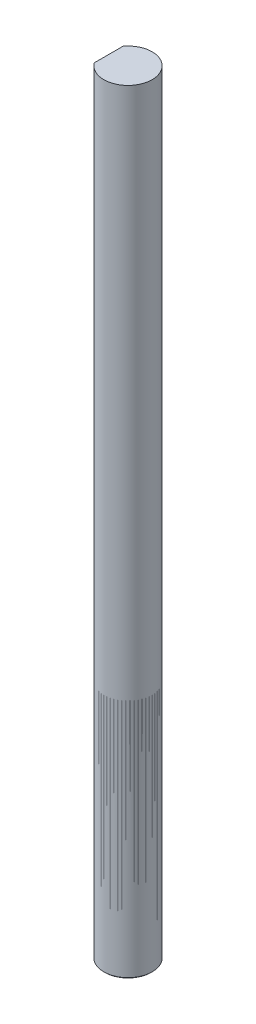
ISO-10303-21;
HEADER;
FILE_DESCRIPTION(('STEP AP214'),'2;1');
FILE_NAME('part.step','',(''),(''),'','','');
FILE_SCHEMA(('AUTOMOTIVE_DESIGN { 1 0 10303 214 1 1 1 1 }'));
ENDSEC;
DATA;
#1=APPLICATION_CONTEXT('core data for automotive mechanical design processes');
#2=APPLICATION_PROTOCOL_DEFINITION('international standard','automotive_design',2000,#1);
#3=PRODUCT_CONTEXT('',#1,'mechanical');
#4=PRODUCT('Part','Part','',(#3));
#5=PRODUCT_RELATED_PRODUCT_CATEGORY('part','',(#4));
#6=PRODUCT_DEFINITION_FORMATION('','',#4);
#7=PRODUCT_DEFINITION_CONTEXT('part definition',#1,'design');
#8=PRODUCT_DEFINITION('design','',#6,#7);
#9=PRODUCT_DEFINITION_SHAPE('','',#8);
#10=(LENGTH_UNIT() NAMED_UNIT(*) SI_UNIT(.MILLI.,.METRE.));
#11=(NAMED_UNIT(*) PLANE_ANGLE_UNIT() SI_UNIT($,.RADIAN.));
#12=(NAMED_UNIT(*) SI_UNIT($,.STERADIAN.) SOLID_ANGLE_UNIT());
#13=UNCERTAINTY_MEASURE_WITH_UNIT(LENGTH_MEASURE(1.E-05),#10,'distance_accuracy_value','');
#14=(GEOMETRIC_REPRESENTATION_CONTEXT(3) GLOBAL_UNCERTAINTY_ASSIGNED_CONTEXT((#13)) GLOBAL_UNIT_ASSIGNED_CONTEXT((#10,
#11,#12)) REPRESENTATION_CONTEXT('',''));
#15=CARTESIAN_POINT('',(0.,0.,0.));
#16=DIRECTION('',(0.,0.,1.));
#17=DIRECTION('',(1.,0.,0.));
#18=AXIS2_PLACEMENT_3D('',#15,#16,#17);
#19=CARTESIAN_POINT('',(0.,0.127000000000009,0.));
#20=DIRECTION('',(0.,1.,0.));
#21=DIRECTION('',(0.,0.,1.));
#22=AXIS2_PLACEMENT_3D('',#19,#20,#21);
#23=CONICAL_SURFACE('',#22,3.17119,0.785398163397443);
#24=DIRECTION('',(0.,0.707106781186551,-0.707106781186544));
#25=VECTOR('',#24,1.);
#26=CARTESIAN_POINT('',(0.,0.127000000000009,-3.17119));
#27=LINE('',#26,#25);
#28=CARTESIAN_POINT('',(0.,0.,-3.04419));
#29=VERTEX_POINT('',#28);
#30=CARTESIAN_POINT('',(0.,0.127000000000009,-3.17119));
#31=VERTEX_POINT('',#30);
#32=EDGE_CURVE('P0_E52',#29,#31,#27,.T.);
#33=ORIENTED_EDGE('',*,*,#32,.F.);
#34=CARTESIAN_POINT('',(0.,0.,0.));
#35=DIRECTION('',(0.,-1.,0.));
#36=DIRECTION('',(0.,0.,1.));
#37=AXIS2_PLACEMENT_3D('',#34,#35,#36);
#38=CIRCLE('',#37,3.04419);
#39=CARTESIAN_POINT('',(-2.54381,0.,-1.67216130800828));
#40=VERTEX_POINT('',#39);
#41=EDGE_CURVE('P0_E14',#40,#29,#38,.T.);
#42=ORIENTED_EDGE('',*,*,#41,.F.);
#43=CARTESIAN_POINT('',(-2.54381,0.127000000000009,-1.89353550270387));
#44=CARTESIAN_POINT('',(-2.54381,0.0833862535559544,-1.8204935785422));
#45=CARTESIAN_POINT('',(-2.54381,0.0409575857320586,-1.7467250910073));
#46=CARTESIAN_POINT('',(-2.54381,0.,-1.67216130800828));
#47=(BOUNDED_CURVE() B_SPLINE_CURVE(3,(#43,#44,#45,#46),.UNSPECIFIED.,.F.,
.F.) B_SPLINE_CURVE_WITH_KNOTS((4,4),(0.,0.000255216641458047),
.UNSPECIFIED.) CURVE() GEOMETRIC_REPRESENTATION_ITEM() RATIONAL_B_SPLINE_CURVE((1.,1.,1.,1.)) REPRESENTATION_ITEM(''));
#48=CARTESIAN_POINT('',(-2.54381,0.127000000000009,-1.89353550270387));
#49=VERTEX_POINT('',#48);
#50=EDGE_CURVE('P0_E104',#49,#40,#47,.T.);
#51=ORIENTED_EDGE('',*,*,#50,.F.);
#52=CARTESIAN_POINT('',(0.,0.127000000000009,0.));
#53=DIRECTION('',(0.,1.,0.));
#54=DIRECTION('',(0.,0.,1.));
#55=AXIS2_PLACEMENT_3D('',#52,#53,#54);
#56=CIRCLE('',#55,3.17119);
#57=EDGE_CURVE('P0_E99',#31,#49,#56,.T.);
#58=ORIENTED_EDGE('',*,*,#57,.F.);
#59=EDGE_LOOP('',(#33,#42,#51,#58));
#60=FACE_BOUND('',#59,.T.);
#61=ADVANCED_FACE('P0_F48',(#60),#23,.T.);
#62=CARTESIAN_POINT('',(0.,0.,0.));
#63=DIRECTION('',(0.,1.,0.));
#64=DIRECTION('',(1.,0.,0.));
#65=AXIS2_PLACEMENT_3D('',#62,#63,#64);
#66=PLANE('',#65);
#67=DIRECTION('',(0.,0.,1.));
#68=VECTOR('',#67,1.);
#69=CARTESIAN_POINT('',(-2.54381,0.,-1.89353550270387));
#70=LINE('',#69,#68);
#71=CARTESIAN_POINT('',(-2.54381,0.,1.67216130800828));
#72=VERTEX_POINT('',#71);
#73=EDGE_CURVE('P0_E59',#40,#72,#70,.T.);
#74=ORIENTED_EDGE('',*,*,#73,.F.);
#75=ORIENTED_EDGE('',*,*,#41,.T.);
#76=CARTESIAN_POINT('',(0.,0.,0.));
#77=DIRECTION('',(0.,-1.,0.));
#78=DIRECTION('',(0.,0.,1.));
#79=AXIS2_PLACEMENT_3D('',#76,#77,#78);
#80=CIRCLE('',#79,3.04419);
#81=CARTESIAN_POINT('',(0.,0.,3.04419));
#82=VERTEX_POINT('',#81);
#83=EDGE_CURVE('P0_E125',#29,#82,#80,.T.);
#84=ORIENTED_EDGE('',*,*,#83,.T.);
#85=CARTESIAN_POINT('',(0.,0.,0.));
#86=DIRECTION('',(0.,-1.,0.));
#87=DIRECTION('',(0.,0.,1.));
#88=AXIS2_PLACEMENT_3D('',#85,#86,#87);
#89=CIRCLE('',#88,3.04419);
#90=EDGE_CURVE('P0_E142',#82,#72,#89,.T.);
#91=ORIENTED_EDGE('',*,*,#90,.T.);
#92=EDGE_LOOP('',(#74,#75,#84,#91));
#93=FACE_BOUND('',#92,.T.);
#94=ADVANCED_FACE('P0_F50',(#93),#66,.F.);
#95=CARTESIAN_POINT('',(-2.54381,31.75,-1.89353550270387));
#96=DIRECTION('',(1.,0.,0.));
#97=DIRECTION('',(0.,1.,0.));
#98=AXIS2_PLACEMENT_3D('',#95,#96,#97);
#99=PLANE('',#98);
#100=DIRECTION('',(0.,-1.,0.));
#101=VECTOR('',#100,1.);
#102=CARTESIAN_POINT('',(-2.54381,31.75,1.89353550270387));
#103=LINE('',#102,#101);
#104=CARTESIAN_POINT('',(-2.54381,101.6,1.89353550270387));
#105=VERTEX_POINT('',#104);
#106=CARTESIAN_POINT('',(-2.54381,0.127000000000009,1.89353550270387));
#107=VERTEX_POINT('',#106);
#108=EDGE_CURVE('P0_E158',#105,#107,#103,.T.);
#109=ORIENTED_EDGE('',*,*,#108,.F.);
#110=DIRECTION('',(0.,0.,1.));
#111=VECTOR('',#110,1.);
#112=CARTESIAN_POINT('',(-2.54381,101.6,1.6721613080083));
#113=LINE('',#112,#111);
#114=CARTESIAN_POINT('',(-2.54381,101.6,-1.89353550270387));
#115=VERTEX_POINT('',#114);
#116=EDGE_CURVE('P0_E131',#115,#105,#113,.T.);
#117=ORIENTED_EDGE('',*,*,#116,.F.);
#118=DIRECTION('',(0.,-1.,0.));
#119=VECTOR('',#118,1.);
#120=CARTESIAN_POINT('',(-2.54381,31.75,-1.89353550270387));
#121=LINE('',#120,#119);
#122=EDGE_CURVE('P0_E108',#115,#49,#121,.T.);
#123=ORIENTED_EDGE('',*,*,#122,.T.);
#124=ORIENTED_EDGE('',*,*,#50,.T.);
#125=ORIENTED_EDGE('',*,*,#73,.T.);
#126=CARTESIAN_POINT('',(-2.54381,0.,1.67216130800828));
#127=CARTESIAN_POINT('',(-2.54381,0.0409575857320651,1.7467250910073));
#128=CARTESIAN_POINT('',(-2.54381,0.0833862535559509,1.8204935785422));
#129=CARTESIAN_POINT('',(-2.54381,0.127000000000009,1.89353550270387));
#130=(BOUNDED_CURVE() B_SPLINE_CURVE(3,(#126,#127,#128,#129),.UNSPECIFIED.,.F.,
.F.) B_SPLINE_CURVE_WITH_KNOTS((4,4),(0.,0.000255216641458047),
.UNSPECIFIED.) CURVE() GEOMETRIC_REPRESENTATION_ITEM() RATIONAL_B_SPLINE_CURVE((1.,1.,1.,1.)) REPRESENTATION_ITEM(''));
#131=EDGE_CURVE('P0_E146',#72,#107,#130,.T.);
#132=ORIENTED_EDGE('',*,*,#131,.T.);
#133=EDGE_LOOP('',(#109,#117,#123,#124,#125,#132));
#134=FACE_BOUND('',#133,.T.);
#135=ADVANCED_FACE('P0_F169',(#134),#99,.F.);
#136=CARTESIAN_POINT('',(0.,31.75,0.));
#137=DIRECTION('',(0.,-1.,0.));
#138=DIRECTION('',(0.,0.,-1.));
#139=AXIS2_PLACEMENT_3D('',#136,#137,#138);
#140=CYLINDRICAL_SURFACE('',#139,3.17119);
#141=DIRECTION('',(0.,-1.,0.));
#142=VECTOR('',#141,1.);
#143=CARTESIAN_POINT('',(0.,31.75,-3.17119));
#144=LINE('',#143,#142);
#145=CARTESIAN_POINT('',(0.,31.75,-3.17119));
#146=VERTEX_POINT('',#145);
#147=EDGE_CURVE('P0_E109',#146,#31,#144,.T.);
#148=ORIENTED_EDGE('',*,*,#147,.F.);
#149=ORIENTED_EDGE('',*,*,#147,.T.);
#150=ORIENTED_EDGE('',*,*,#57,.T.);
#151=ORIENTED_EDGE('',*,*,#122,.F.);
#152=CARTESIAN_POINT('',(0.,101.6,0.));
#153=DIRECTION('',(0.,1.,0.));
#154=DIRECTION('',(0.,0.,1.));
#155=AXIS2_PLACEMENT_3D('',#152,#153,#154);
#156=CIRCLE('',#155,3.17119);
#157=EDGE_CURVE('P0_E138',#105,#115,#156,.T.);
#158=ORIENTED_EDGE('',*,*,#157,.F.);
#159=ORIENTED_EDGE('',*,*,#108,.T.);
#160=CARTESIAN_POINT('',(0.,0.127000000000009,0.));
#161=DIRECTION('',(0.,1.,0.));
#162=DIRECTION('',(0.,0.,1.));
#163=AXIS2_PLACEMENT_3D('',#160,#161,#162);
#164=CIRCLE('',#163,3.17119);
#165=CARTESIAN_POINT('',(0.,0.127000000000009,3.17119));
#166=VERTEX_POINT('',#165);
#167=EDGE_CURVE('P0_E143',#107,#166,#164,.T.);
#168=ORIENTED_EDGE('',*,*,#167,.T.);
#169=DIRECTION('',(0.,-1.,0.));
#170=VECTOR('',#169,1.);
#171=CARTESIAN_POINT('',(0.,31.75,3.17119));
#172=LINE('',#171,#170);
#173=CARTESIAN_POINT('',(0.,31.75,3.17119));
#174=VERTEX_POINT('',#173);
#175=EDGE_CURVE('P0_E93',#174,#166,#172,.T.);
#176=ORIENTED_EDGE('',*,*,#175,.F.);
#177=ORIENTED_EDGE('',*,*,#175,.T.);
#178=CARTESIAN_POINT('',(0.,0.127000000000009,0.));
#179=DIRECTION('',(0.,1.,0.));
#180=DIRECTION('',(0.,0.,1.));
#181=AXIS2_PLACEMENT_3D('',#178,#179,#180);
#182=CIRCLE('',#181,3.17119);
#183=EDGE_CURVE('P0_E117',#166,#31,#182,.T.);
#184=ORIENTED_EDGE('',*,*,#183,.T.);
#185=EDGE_LOOP('',(#148,#149,#150,#151,#158,#159,#168,#176,#177,#184));
#186=FACE_BOUND('',#185,.T.);
#187=ADVANCED_FACE('P0_F112',(#186),#140,.T.);
#188=CARTESIAN_POINT('',(0.,0.127000000000009,0.));
#189=DIRECTION('',(0.,1.,0.));
#190=DIRECTION('',(0.,0.,1.));
#191=AXIS2_PLACEMENT_3D('',#188,#189,#190);
#192=CONICAL_SURFACE('',#191,3.17119,0.785398163397443);
#193=ORIENTED_EDGE('',*,*,#90,.F.);
#194=DIRECTION('',(0.,0.707106781186551,0.707106781186544));
#195=VECTOR('',#194,1.);
#196=CARTESIAN_POINT('',(0.,0.127000000000009,3.17119));
#197=LINE('',#196,#195);
#198=EDGE_CURVE('P0_E121',#82,#166,#197,.T.);
#199=ORIENTED_EDGE('',*,*,#198,.T.);
#200=ORIENTED_EDGE('',*,*,#167,.F.);
#201=ORIENTED_EDGE('',*,*,#131,.F.);
#202=EDGE_LOOP('',(#193,#199,#200,#201));
#203=FACE_BOUND('',#202,.T.);
#204=ADVANCED_FACE('P0_F199',(#203),#192,.T.);
#205=CARTESIAN_POINT('',(0.,0.127000000000009,0.));
#206=DIRECTION('',(0.,1.,0.));
#207=DIRECTION('',(0.,0.,1.));
#208=AXIS2_PLACEMENT_3D('',#205,#206,#207);
#209=CONICAL_SURFACE('',#208,3.17119,0.785398163397443);
#210=ORIENTED_EDGE('',*,*,#83,.F.);
#211=ORIENTED_EDGE('',*,*,#32,.T.);
#212=ORIENTED_EDGE('',*,*,#183,.F.);
#213=ORIENTED_EDGE('',*,*,#198,.F.);
#214=EDGE_LOOP('',(#210,#211,#212,#213));
#215=FACE_BOUND('',#214,.T.);
#216=ADVANCED_FACE('P0_F123',(#215),#209,.T.);
#217=CARTESIAN_POINT('',(0.,101.6,0.));
#218=DIRECTION('',(0.,1.,0.));
#219=DIRECTION('',(1.,0.,0.));
#220=AXIS2_PLACEMENT_3D('',#217,#218,#219);
#221=PLANE('',#220);
#222=ORIENTED_EDGE('',*,*,#157,.T.);
#223=ORIENTED_EDGE('',*,*,#116,.T.);
#224=EDGE_LOOP('',(#222,#223));
#225=FACE_BOUND('',#224,.T.);
#226=ADVANCED_FACE('P0_F193',(#225),#221,.T.);
#227=CLOSED_SHELL('',(#61,#94,#135,#187,#204,#216,#226));
#228=MANIFOLD_SOLID_BREP('P0_B2',#227);
#229=CARTESIAN_POINT('',(0.,31.75,0.));
#230=DIRECTION('',(0.,-1.,0.));
#231=DIRECTION('',(0.,0.,-1.));
#232=AXIS2_PLACEMENT_3D('',#229,#230,#231);
#233=CONICAL_SURFACE('',#232,3.04419,0.785398163397443);
#234=DIRECTION('',(0.,-0.707106781186551,0.707106781186544));
#235=VECTOR('',#234,1.);
#236=CARTESIAN_POINT('',(0.,31.75,3.04419));
#237=LINE('',#236,#235);
#238=CARTESIAN_POINT('',(0.,31.75,3.04419));
#239=VERTEX_POINT('',#238);
#240=CARTESIAN_POINT('',(0.,31.623,3.17119));
#241=VERTEX_POINT('',#240);
#242=EDGE_CURVE('P1_E148',#239,#241,#237,.T.);
#243=ORIENTED_EDGE('',*,*,#242,.F.);
#244=CARTESIAN_POINT('',(0.,31.75,0.));
#245=DIRECTION('',(0.,1.,0.));
#246=DIRECTION('',(0.,0.,1.));
#247=AXIS2_PLACEMENT_3D('',#244,#245,#246);
#248=CIRCLE('',#247,3.04419);
#249=CARTESIAN_POINT('',(-2.54381,31.75,1.6721613080083));
#250=VERTEX_POINT('',#249);
#251=EDGE_CURVE('P1_E29',#250,#239,#248,.T.);
#252=ORIENTED_EDGE('',*,*,#251,.F.);
#253=CARTESIAN_POINT('',(-2.54381,31.623,1.89353550270387));
#254=CARTESIAN_POINT('',(-2.54381,31.666613746444,1.82049357854221));
#255=CARTESIAN_POINT('',(-2.54381,31.7090424142679,1.74672509100733));
#256=CARTESIAN_POINT('',(-2.54381,31.75,1.6721613080083));
#257=(BOUNDED_CURVE() B_SPLINE_CURVE(3,(#253,#254,#255,#256),.UNSPECIFIED.,.F.,
.F.) B_SPLINE_CURVE_WITH_KNOTS((4,4),(0.,0.000255216641458017),
.UNSPECIFIED.) CURVE() GEOMETRIC_REPRESENTATION_ITEM() RATIONAL_B_SPLINE_CURVE((1.,1.,1.,1.)) REPRESENTATION_ITEM(''));
#258=CARTESIAN_POINT('',(-2.54381,31.623,1.89353550270387));
#259=VERTEX_POINT('',#258);
#260=EDGE_CURVE('P1_E204',#259,#250,#257,.T.);
#261=ORIENTED_EDGE('',*,*,#260,.F.);
#262=CARTESIAN_POINT('',(0.,31.623,0.));
#263=DIRECTION('',(0.,-1.,0.));
#264=DIRECTION('',(0.,0.,1.));
#265=AXIS2_PLACEMENT_3D('',#262,#263,#264);
#266=CIRCLE('',#265,3.17119);
#267=EDGE_CURVE('P1_E159',#241,#259,#266,.T.);
#268=ORIENTED_EDGE('',*,*,#267,.F.);
#269=EDGE_LOOP('',(#243,#252,#261,#268));
#270=FACE_BOUND('',#269,.T.);
#271=ADVANCED_FACE('P1_F18',(#270),#233,.T.);
#272=CARTESIAN_POINT('',(0.,0.127000000000009,0.));
#273=DIRECTION('',(0.,1.,0.));
#274=DIRECTION('',(0.,0.,1.));
#275=AXIS2_PLACEMENT_3D('',#272,#273,#274);
#276=CONICAL_SURFACE('',#275,3.17119,0.785398163397443);
#277=DIRECTION('',(0.,0.707106781186551,-0.707106781186544));
#278=VECTOR('',#277,1.);
#279=CARTESIAN_POINT('',(0.,0.127000000000009,-3.17119));
#280=LINE('',#279,#278);
#281=CARTESIAN_POINT('',(0.,0.,-3.04419));
#282=VERTEX_POINT('',#281);
#283=CARTESIAN_POINT('',(0.,0.127000000000009,-3.17119));
#284=VERTEX_POINT('',#283);
#285=EDGE_CURVE('P1_E22',#282,#284,#280,.T.);
#286=ORIENTED_EDGE('',*,*,#285,.F.);
#287=CARTESIAN_POINT('',(0.,0.,0.));
#288=DIRECTION('',(0.,-1.,0.));
#289=DIRECTION('',(0.,0.,1.));
#290=AXIS2_PLACEMENT_3D('',#287,#288,#289);
#291=CIRCLE('',#290,3.04419);
#292=CARTESIAN_POINT('',(-2.54381,0.,-1.67216130800828));
#293=VERTEX_POINT('',#292);
#294=EDGE_CURVE('P1_E12',#293,#282,#291,.T.);
#295=ORIENTED_EDGE('',*,*,#294,.F.);
#296=CARTESIAN_POINT('',(-2.54381,0.127000000000009,-1.89353550270387));
#297=CARTESIAN_POINT('',(-2.54381,0.0833862535559544,-1.8204935785422));
#298=CARTESIAN_POINT('',(-2.54381,0.0409575857320586,-1.7467250910073));
#299=CARTESIAN_POINT('',(-2.54381,0.,-1.67216130800828));
#300=(BOUNDED_CURVE() B_SPLINE_CURVE(3,(#296,#297,#298,#299),.UNSPECIFIED.,.F.,
.F.) B_SPLINE_CURVE_WITH_KNOTS((4,4),(0.,0.000255216641458047),
.UNSPECIFIED.) CURVE() GEOMETRIC_REPRESENTATION_ITEM() RATIONAL_B_SPLINE_CURVE((1.,1.,1.,1.)) REPRESENTATION_ITEM(''));
#301=CARTESIAN_POINT('',(-2.54381,0.127000000000009,-1.89353550270387));
#302=VERTEX_POINT('',#301);
#303=EDGE_CURVE('P1_E158',#302,#293,#300,.T.);
#304=ORIENTED_EDGE('',*,*,#303,.F.);
#305=CARTESIAN_POINT('',(0.,0.127000000000009,0.));
#306=DIRECTION('',(0.,1.,0.));
#307=DIRECTION('',(0.,0.,1.));
#308=AXIS2_PLACEMENT_3D('',#305,#306,#307);
#309=CIRCLE('',#308,3.17119);
#310=EDGE_CURVE('P1_E76',#284,#302,#309,.T.);
#311=ORIENTED_EDGE('',*,*,#310,.F.);
#312=EDGE_LOOP('',(#286,#295,#304,#311));
#313=FACE_BOUND('',#312,.T.);
#314=ADVANCED_FACE('P1_F272',(#313),#276,.T.);
#315=CARTESIAN_POINT('',(0.,0.,0.));
#316=DIRECTION('',(0.,1.,0.));
#317=DIRECTION('',(1.,0.,0.));
#318=AXIS2_PLACEMENT_3D('',#315,#316,#317);
#319=PLANE('',#318);
#320=DIRECTION('',(0.,0.,1.));
#321=VECTOR('',#320,1.);
#322=CARTESIAN_POINT('',(-2.54381,0.,-1.89353550270387));
#323=LINE('',#322,#321);
#324=CARTESIAN_POINT('',(-2.54381,0.,1.67216130800828));
#325=VERTEX_POINT('',#324);
#326=EDGE_CURVE('P1_E201',#293,#325,#323,.T.);
#327=ORIENTED_EDGE('',*,*,#326,.F.);
#328=ORIENTED_EDGE('',*,*,#294,.T.);
#329=CARTESIAN_POINT('',(0.,0.,0.));
#330=DIRECTION('',(0.,-1.,0.));
#331=DIRECTION('',(0.,0.,1.));
#332=AXIS2_PLACEMENT_3D('',#329,#330,#331);
#333=CIRCLE('',#332,3.04419);
#334=CARTESIAN_POINT('',(0.,0.,3.04419));
#335=VERTEX_POINT('',#334);
#336=EDGE_CURVE('P1_E167',#282,#335,#333,.T.);
#337=ORIENTED_EDGE('',*,*,#336,.T.);
#338=CARTESIAN_POINT('',(0.,0.,0.));
#339=DIRECTION('',(0.,-1.,0.));
#340=DIRECTION('',(0.,0.,1.));
#341=AXIS2_PLACEMENT_3D('',#338,#339,#340);
#342=CIRCLE('',#341,3.04419);
#343=EDGE_CURVE('P1_E87',#335,#325,#342,.T.);
#344=ORIENTED_EDGE('',*,*,#343,.T.);
#345=EDGE_LOOP('',(#327,#328,#337,#344));
#346=FACE_BOUND('',#345,.T.);
#347=ADVANCED_FACE('P1_F277',(#346),#319,.F.);
#348=CARTESIAN_POINT('',(0.,31.75,0.));
#349=DIRECTION('',(0.,1.,0.));
#350=DIRECTION('',(1.,0.,0.));
#351=AXIS2_PLACEMENT_3D('',#348,#349,#350);
#352=PLANE('',#351);
#353=DIRECTION('',(0.,0.,1.));
#354=VECTOR('',#353,1.);
#355=CARTESIAN_POINT('',(-2.54381,31.75,-1.89353550270387));
#356=LINE('',#355,#354);
#357=CARTESIAN_POINT('',(-2.54381,31.75,-1.6721613080083));
#358=VERTEX_POINT('',#357);
#359=EDGE_CURVE('P1_E224',#358,#250,#356,.T.);
#360=ORIENTED_EDGE('',*,*,#359,.T.);
#361=ORIENTED_EDGE('',*,*,#251,.T.);
#362=CARTESIAN_POINT('',(0.,31.75,0.));
#363=DIRECTION('',(0.,1.,0.));
#364=DIRECTION('',(0.,0.,1.));
#365=AXIS2_PLACEMENT_3D('',#362,#363,#364);
#366=CIRCLE('',#365,3.04419);
#367=CARTESIAN_POINT('',(0.,31.75,-3.04419));
#368=VERTEX_POINT('',#367);
#369=EDGE_CURVE('P1_E142',#239,#368,#366,.T.);
#370=ORIENTED_EDGE('',*,*,#369,.T.);
#371=CARTESIAN_POINT('',(0.,31.75,0.));
#372=DIRECTION('',(0.,1.,0.));
#373=DIRECTION('',(0.,0.,1.));
#374=AXIS2_PLACEMENT_3D('',#371,#372,#373);
#375=CIRCLE('',#374,3.04419);
#376=EDGE_CURVE('P1_E126',#368,#358,#375,.T.);
#377=ORIENTED_EDGE('',*,*,#376,.T.);
#378=EDGE_LOOP('',(#360,#361,#370,#377));
#379=FACE_BOUND('',#378,.T.);
#380=ADVANCED_FACE('P1_F146',(#379),#352,.T.);
#381=CARTESIAN_POINT('',(-2.54381,31.75,-1.89353550270387));
#382=DIRECTION('',(1.,0.,0.));
#383=DIRECTION('',(0.,1.,0.));
#384=AXIS2_PLACEMENT_3D('',#381,#382,#383);
#385=PLANE('',#384);
#386=DIRECTION('',(0.,-1.,0.));
#387=VECTOR('',#386,1.);
#388=CARTESIAN_POINT('',(-2.54381,31.75,-1.89353550270387));
#389=LINE('',#388,#387);
#390=CARTESIAN_POINT('',(-2.54381,31.623,-1.89353550270387));
#391=VERTEX_POINT('',#390);
#392=EDGE_CURVE('P1_E160',#391,#302,#389,.T.);
#393=ORIENTED_EDGE('',*,*,#392,.T.);
#394=ORIENTED_EDGE('',*,*,#303,.T.);
#395=ORIENTED_EDGE('',*,*,#326,.T.);
#396=CARTESIAN_POINT('',(-2.54381,0.,1.67216130800828));
#397=CARTESIAN_POINT('',(-2.54381,0.0409575857320651,1.7467250910073));
#398=CARTESIAN_POINT('',(-2.54381,0.0833862535559509,1.8204935785422));
#399=CARTESIAN_POINT('',(-2.54381,0.127000000000009,1.89353550270387));
#400=(BOUNDED_CURVE() B_SPLINE_CURVE(3,(#396,#397,#398,#399),.UNSPECIFIED.,.F.,
.F.) B_SPLINE_CURVE_WITH_KNOTS((4,4),(0.,0.000255216641458047),
.UNSPECIFIED.) CURVE() GEOMETRIC_REPRESENTATION_ITEM() RATIONAL_B_SPLINE_CURVE((1.,1.,1.,1.)) REPRESENTATION_ITEM(''));
#401=CARTESIAN_POINT('',(-2.54381,0.127000000000009,1.89353550270387));
#402=VERTEX_POINT('',#401);
#403=EDGE_CURVE('P1_E179',#325,#402,#400,.T.);
#404=ORIENTED_EDGE('',*,*,#403,.T.);
#405=DIRECTION('',(0.,-1.,0.));
#406=VECTOR('',#405,1.);
#407=CARTESIAN_POINT('',(-2.54381,31.75,1.89353550270387));
#408=LINE('',#407,#406);
#409=EDGE_CURVE('P1_E156',#259,#402,#408,.T.);
#410=ORIENTED_EDGE('',*,*,#409,.F.);
#411=ORIENTED_EDGE('',*,*,#260,.T.);
#412=ORIENTED_EDGE('',*,*,#359,.F.);
#413=CARTESIAN_POINT('',(-2.54381,31.75,-1.6721613080083));
#414=CARTESIAN_POINT('',(-2.54381,31.7090424142679,-1.74672509100732));
#415=CARTESIAN_POINT('',(-2.54381,31.666613746444,-1.82049357854221));
#416=CARTESIAN_POINT('',(-2.54381,31.623,-1.89353550270387));
#417=(BOUNDED_CURVE() B_SPLINE_CURVE(3,(#413,#414,#415,#416),.UNSPECIFIED.,.F.,
.F.) B_SPLINE_CURVE_WITH_KNOTS((4,4),(0.,0.000255216641458016),
.UNSPECIFIED.) CURVE() GEOMETRIC_REPRESENTATION_ITEM() RATIONAL_B_SPLINE_CURVE((1.,1.,1.,1.)) REPRESENTATION_ITEM(''));
#418=EDGE_CURVE('P1_E133',#358,#391,#417,.T.);
#419=ORIENTED_EDGE('',*,*,#418,.T.);
#420=EDGE_LOOP('',(#393,#394,#395,#404,#410,#411,#412,#419));
#421=FACE_BOUND('',#420,.T.);
#422=ADVANCED_FACE('P1_F254',(#421),#385,.F.);
#423=CARTESIAN_POINT('',(0.,31.75,0.));
#424=DIRECTION('',(0.,-1.,0.));
#425=DIRECTION('',(0.,0.,-1.));
#426=AXIS2_PLACEMENT_3D('',#423,#424,#425);
#427=CYLINDRICAL_SURFACE('',#426,3.17119);
#428=DIRECTION('',(0.,-1.,0.));
#429=VECTOR('',#428,1.);
#430=CARTESIAN_POINT('',(0.,31.75,3.17119));
#431=LINE('',#430,#429);
#432=CARTESIAN_POINT('',(0.,0.127000000000009,3.17119));
#433=VERTEX_POINT('',#432);
#434=EDGE_CURVE('P1_E62',#241,#433,#431,.T.);
#435=ORIENTED_EDGE('',*,*,#434,.F.);
#436=ORIENTED_EDGE('',*,*,#267,.T.);
#437=ORIENTED_EDGE('',*,*,#409,.T.);
#438=CARTESIAN_POINT('',(0.,0.127000000000009,0.));
#439=DIRECTION('',(0.,1.,0.));
#440=DIRECTION('',(0.,0.,1.));
#441=AXIS2_PLACEMENT_3D('',#438,#439,#440);
#442=CIRCLE('',#441,3.17119);
#443=EDGE_CURVE('P1_E174',#402,#433,#442,.T.);
#444=ORIENTED_EDGE('',*,*,#443,.T.);
#445=EDGE_LOOP('',(#435,#436,#437,#444));
#446=FACE_BOUND('',#445,.T.);
#447=ADVANCED_FACE('P1_F257',(#446),#427,.T.);
#448=CARTESIAN_POINT('',(0.,31.75,0.));
#449=DIRECTION('',(0.,-1.,0.));
#450=DIRECTION('',(0.,0.,-1.));
#451=AXIS2_PLACEMENT_3D('',#448,#449,#450);
#452=CYLINDRICAL_SURFACE('',#451,3.17119);
#453=CARTESIAN_POINT('',(0.,31.623,0.));
#454=DIRECTION('',(0.,-1.,0.));
#455=DIRECTION('',(0.,0.,1.));
#456=AXIS2_PLACEMENT_3D('',#453,#454,#455);
#457=CIRCLE('',#456,3.17119);
#458=CARTESIAN_POINT('',(0.,31.623,-3.17119));
#459=VERTEX_POINT('',#458);
#460=EDGE_CURVE('P1_E137',#391,#459,#457,.T.);
#461=ORIENTED_EDGE('',*,*,#460,.T.);
#462=DIRECTION('',(0.,-1.,0.));
#463=VECTOR('',#462,1.);
#464=CARTESIAN_POINT('',(0.,31.75,-3.17119));
#465=LINE('',#464,#463);
#466=EDGE_CURVE('P1_E196',#459,#284,#465,.T.);
#467=ORIENTED_EDGE('',*,*,#466,.T.);
#468=ORIENTED_EDGE('',*,*,#310,.T.);
#469=ORIENTED_EDGE('',*,*,#392,.F.);
#470=EDGE_LOOP('',(#461,#467,#468,#469));
#471=FACE_BOUND('',#470,.T.);
#472=ADVANCED_FACE('P1_F242',(#471),#452,.T.);
#473=CARTESIAN_POINT('',(0.,31.75,0.));
#474=DIRECTION('',(0.,-1.,0.));
#475=DIRECTION('',(0.,0.,-1.));
#476=AXIS2_PLACEMENT_3D('',#473,#474,#475);
#477=CYLINDRICAL_SURFACE('',#476,3.17119);
#478=CARTESIAN_POINT('',(0.,31.623,0.));
#479=DIRECTION('',(0.,-1.,0.));
#480=DIRECTION('',(0.,0.,1.));
#481=AXIS2_PLACEMENT_3D('',#478,#479,#480);
#482=CIRCLE('',#481,3.17119);
#483=EDGE_CURVE('P1_E143',#459,#241,#482,.T.);
#484=ORIENTED_EDGE('',*,*,#483,.T.);
#485=ORIENTED_EDGE('',*,*,#434,.T.);
#486=CARTESIAN_POINT('',(0.,0.127000000000009,0.));
#487=DIRECTION('',(0.,1.,0.));
#488=DIRECTION('',(0.,0.,1.));
#489=AXIS2_PLACEMENT_3D('',#486,#487,#488);
#490=CIRCLE('',#489,3.17119);
#491=EDGE_CURVE('P1_E170',#433,#284,#490,.T.);
#492=ORIENTED_EDGE('',*,*,#491,.T.);
#493=ORIENTED_EDGE('',*,*,#466,.F.);
#494=EDGE_LOOP('',(#484,#485,#492,#493));
#495=FACE_BOUND('',#494,.T.);
#496=ADVANCED_FACE('P1_F258',(#495),#477,.T.);
#497=CARTESIAN_POINT('',(0.,0.127000000000009,0.));
#498=DIRECTION('',(0.,1.,0.));
#499=DIRECTION('',(0.,0.,1.));
#500=AXIS2_PLACEMENT_3D('',#497,#498,#499);
#501=CONICAL_SURFACE('',#500,3.17119,0.785398163397443);
#502=ORIENTED_EDGE('',*,*,#343,.F.);
#503=DIRECTION('',(0.,0.707106781186551,0.707106781186544));
#504=VECTOR('',#503,1.);
#505=CARTESIAN_POINT('',(0.,0.127000000000009,3.17119));
#506=LINE('',#505,#504);
#507=EDGE_CURVE('P1_E172',#335,#433,#506,.T.);
#508=ORIENTED_EDGE('',*,*,#507,.T.);
#509=ORIENTED_EDGE('',*,*,#443,.F.);
#510=ORIENTED_EDGE('',*,*,#403,.F.);
#511=EDGE_LOOP('',(#502,#508,#509,#510));
#512=FACE_BOUND('',#511,.T.);
#513=ADVANCED_FACE('P1_F260',(#512),#501,.T.);
#514=CARTESIAN_POINT('',(0.,0.127000000000009,0.));
#515=DIRECTION('',(0.,1.,0.));
#516=DIRECTION('',(0.,0.,1.));
#517=AXIS2_PLACEMENT_3D('',#514,#515,#516);
#518=CONICAL_SURFACE('',#517,3.17119,0.785398163397443);
#519=ORIENTED_EDGE('',*,*,#336,.F.);
#520=ORIENTED_EDGE('',*,*,#285,.T.);
#521=ORIENTED_EDGE('',*,*,#491,.F.);
#522=ORIENTED_EDGE('',*,*,#507,.F.);
#523=EDGE_LOOP('',(#519,#520,#521,#522));
#524=FACE_BOUND('',#523,.T.);
#525=ADVANCED_FACE('P1_F267',(#524),#518,.T.);
#526=CARTESIAN_POINT('',(0.,31.75,0.));
#527=DIRECTION('',(0.,-1.,0.));
#528=DIRECTION('',(0.,0.,-1.));
#529=AXIS2_PLACEMENT_3D('',#526,#527,#528);
#530=CONICAL_SURFACE('',#529,3.04419,0.785398163397443);
#531=ORIENTED_EDGE('',*,*,#376,.F.);
#532=DIRECTION('',(0.,-0.707106781186551,-0.707106781186544));
#533=VECTOR('',#532,1.);
#534=CARTESIAN_POINT('',(0.,31.75,-3.04419));
#535=LINE('',#534,#533);
#536=EDGE_CURVE('P1_E130',#368,#459,#535,.T.);
#537=ORIENTED_EDGE('',*,*,#536,.T.);
#538=ORIENTED_EDGE('',*,*,#460,.F.);
#539=ORIENTED_EDGE('',*,*,#418,.F.);
#540=EDGE_LOOP('',(#531,#537,#538,#539));
#541=FACE_BOUND('',#540,.T.);
#542=ADVANCED_FACE('P1_F128',(#541),#530,.T.);
#543=CARTESIAN_POINT('',(0.,31.75,0.));
#544=DIRECTION('',(0.,-1.,0.));
#545=DIRECTION('',(0.,0.,-1.));
#546=AXIS2_PLACEMENT_3D('',#543,#544,#545);
#547=CONICAL_SURFACE('',#546,3.04419,0.785398163397443);
#548=ORIENTED_EDGE('',*,*,#369,.F.);
#549=ORIENTED_EDGE('',*,*,#242,.T.);
#550=ORIENTED_EDGE('',*,*,#483,.F.);
#551=ORIENTED_EDGE('',*,*,#536,.F.);
#552=EDGE_LOOP('',(#548,#549,#550,#551));
#553=FACE_BOUND('',#552,.T.);
#554=ADVANCED_FACE('P1_F20',(#553),#547,.T.);
#555=CLOSED_SHELL('',(#271,#314,#347,#380,#422,#447,#472,#496,#513,#525,#542,#554));
#556=MANIFOLD_SOLID_BREP('P1_B1',#555);
#557=ADVANCED_BREP_SHAPE_REPRESENTATION('',(#18,#228,#556),#14);
#558=SHAPE_DEFINITION_REPRESENTATION(#9,#557);
ENDSEC;
END-ISO-10303-21;
